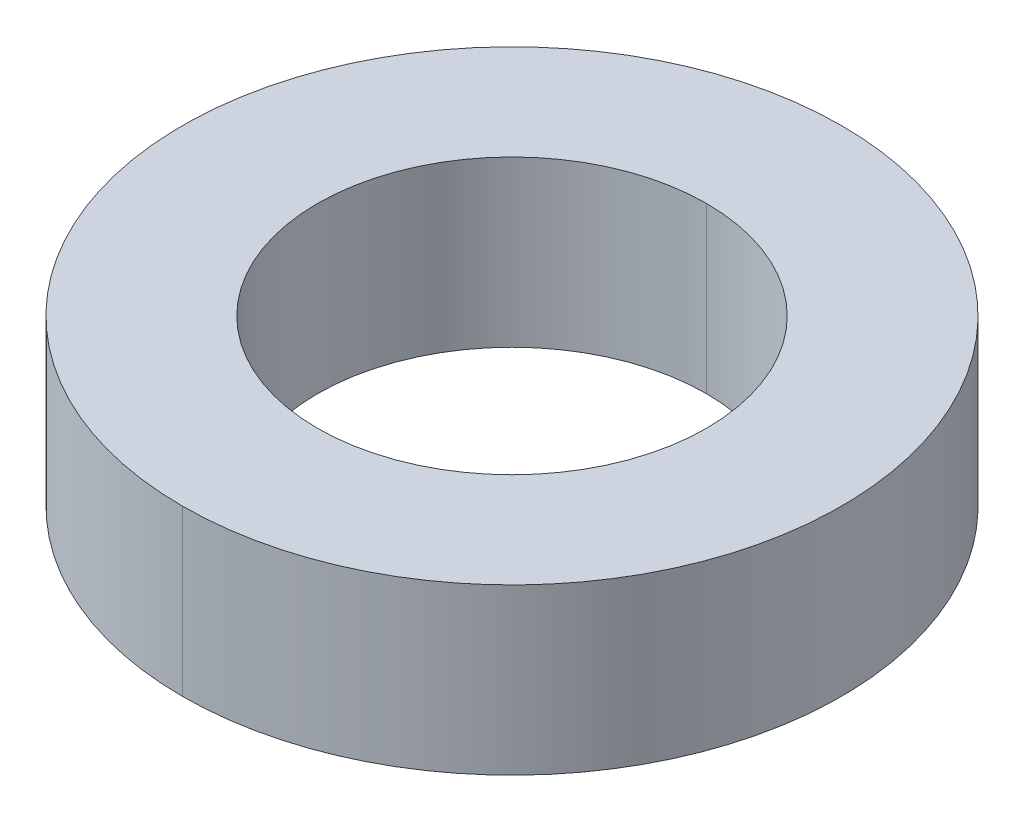
ISO-10303-21;
HEADER;
FILE_DESCRIPTION(('STEP AP214'),'2;1');
FILE_NAME('part.step','',(''),(''),'','','');
FILE_SCHEMA(('AUTOMOTIVE_DESIGN { 1 0 10303 214 1 1 1 1 }'));
ENDSEC;
DATA;
#1=APPLICATION_CONTEXT('core data for automotive mechanical design processes');
#2=APPLICATION_PROTOCOL_DEFINITION('international standard','automotive_design',2000,#1);
#3=PRODUCT_CONTEXT('',#1,'mechanical');
#4=PRODUCT('Part','Part','',(#3));
#5=PRODUCT_RELATED_PRODUCT_CATEGORY('part','',(#4));
#6=PRODUCT_DEFINITION_FORMATION('','',#4);
#7=PRODUCT_DEFINITION_CONTEXT('part definition',#1,'design');
#8=PRODUCT_DEFINITION('design','',#6,#7);
#9=PRODUCT_DEFINITION_SHAPE('','',#8);
#10=(LENGTH_UNIT() NAMED_UNIT(*) SI_UNIT(.MILLI.,.METRE.));
#11=(NAMED_UNIT(*) PLANE_ANGLE_UNIT() SI_UNIT($,.RADIAN.));
#12=(NAMED_UNIT(*) SI_UNIT($,.STERADIAN.) SOLID_ANGLE_UNIT());
#13=UNCERTAINTY_MEASURE_WITH_UNIT(LENGTH_MEASURE(1.E-05),#10,'distance_accuracy_value','');
#14=(GEOMETRIC_REPRESENTATION_CONTEXT(3) GLOBAL_UNCERTAINTY_ASSIGNED_CONTEXT((#13)) GLOBAL_UNIT_ASSIGNED_CONTEXT((#10,
#11,#12)) REPRESENTATION_CONTEXT('',''));
#15=CARTESIAN_POINT('',(0.,0.,0.));
#16=DIRECTION('',(0.,0.,1.));
#17=DIRECTION('',(1.,0.,0.));
#18=AXIS2_PLACEMENT_3D('',#15,#16,#17);
#19=CARTESIAN_POINT('',(0.,3.175,0.));
#20=DIRECTION('',(0.,-1.,0.));
#21=DIRECTION('',(0.,0.,-1.));
#22=AXIS2_PLACEMENT_3D('',#19,#20,#21);
#23=CYLINDRICAL_SURFACE('',#22,3.75);
#24=DIRECTION('',(0.,-1.,0.));
#25=VECTOR('',#24,1.);
#26=CARTESIAN_POINT('',(0.,3.175,3.75));
#27=LINE('',#26,#25);
#28=CARTESIAN_POINT('',(0.,3.175,3.75));
#29=VERTEX_POINT('',#28);
#30=CARTESIAN_POINT('',(0.,0.,3.75));
#31=VERTEX_POINT('',#30);
#32=EDGE_CURVE('E20',#29,#31,#27,.T.);
#33=ORIENTED_EDGE('',*,*,#32,.F.);
#34=CARTESIAN_POINT('',(0.,3.175,0.));
#35=DIRECTION('',(0.,1.,0.));
#36=DIRECTION('',(0.,0.,1.));
#37=AXIS2_PLACEMENT_3D('',#34,#35,#36);
#38=CIRCLE('',#37,3.75);
#39=CARTESIAN_POINT('',(0.,3.175,-3.75));
#40=VERTEX_POINT('',#39);
#41=EDGE_CURVE('E75',#29,#40,#38,.T.);
#42=ORIENTED_EDGE('',*,*,#41,.T.);
#43=DIRECTION('',(0.,-1.,0.));
#44=VECTOR('',#43,1.);
#45=CARTESIAN_POINT('',(0.,3.175,-3.75));
#46=LINE('',#45,#44);
#47=CARTESIAN_POINT('',(0.,0.,-3.75));
#48=VERTEX_POINT('',#47);
#49=EDGE_CURVE('E83',#40,#48,#46,.T.);
#50=ORIENTED_EDGE('',*,*,#49,.T.);
#51=CARTESIAN_POINT('',(0.,0.,0.));
#52=DIRECTION('',(0.,1.,0.));
#53=DIRECTION('',(0.,0.,1.));
#54=AXIS2_PLACEMENT_3D('',#51,#52,#53);
#55=CIRCLE('',#54,3.75);
#56=EDGE_CURVE('E11',#31,#48,#55,.T.);
#57=ORIENTED_EDGE('',*,*,#56,.F.);
#58=EDGE_LOOP('',(#33,#42,#50,#57));
#59=FACE_BOUND('',#58,.T.);
#60=ADVANCED_FACE('F16',(#59),#23,.F.);
#61=CARTESIAN_POINT('',(0.,3.175,0.));
#62=DIRECTION('',(0.,-1.,0.));
#63=DIRECTION('',(0.,0.,-1.));
#64=AXIS2_PLACEMENT_3D('',#61,#62,#63);
#65=CYLINDRICAL_SURFACE('',#64,6.35);
#66=DIRECTION('',(0.,-1.,0.));
#67=VECTOR('',#66,1.);
#68=CARTESIAN_POINT('',(0.,3.175,6.35));
#69=LINE('',#68,#67);
#70=CARTESIAN_POINT('',(0.,3.175,6.35));
#71=VERTEX_POINT('',#70);
#72=CARTESIAN_POINT('',(0.,0.,6.35));
#73=VERTEX_POINT('',#72);
#74=EDGE_CURVE('E70',#71,#73,#69,.T.);
#75=ORIENTED_EDGE('',*,*,#74,.F.);
#76=CARTESIAN_POINT('',(0.,3.175,0.));
#77=DIRECTION('',(0.,1.,0.));
#78=DIRECTION('',(0.,0.,1.));
#79=AXIS2_PLACEMENT_3D('',#76,#77,#78);
#80=CIRCLE('',#79,6.35);
#81=CARTESIAN_POINT('',(0.,3.175,-6.35));
#82=VERTEX_POINT('',#81);
#83=EDGE_CURVE('E64',#82,#71,#80,.T.);
#84=ORIENTED_EDGE('',*,*,#83,.F.);
#85=DIRECTION('',(0.,-1.,0.));
#86=VECTOR('',#85,1.);
#87=CARTESIAN_POINT('',(0.,3.175,-6.35));
#88=LINE('',#87,#86);
#89=CARTESIAN_POINT('',(0.,0.,-6.35));
#90=VERTEX_POINT('',#89);
#91=EDGE_CURVE('E67',#82,#90,#88,.T.);
#92=ORIENTED_EDGE('',*,*,#91,.T.);
#93=CARTESIAN_POINT('',(0.,0.,0.));
#94=DIRECTION('',(0.,1.,0.));
#95=DIRECTION('',(0.,0.,1.));
#96=AXIS2_PLACEMENT_3D('',#93,#94,#95);
#97=CIRCLE('',#96,6.35);
#98=EDGE_CURVE('E27',#90,#73,#97,.T.);
#99=ORIENTED_EDGE('',*,*,#98,.T.);
#100=EDGE_LOOP('',(#75,#84,#92,#99));
#101=FACE_BOUND('',#100,.T.);
#102=ADVANCED_FACE('F66',(#101),#65,.T.);
#103=CARTESIAN_POINT('',(0.,0.,0.));
#104=DIRECTION('',(0.,1.,0.));
#105=DIRECTION('',(1.,0.,0.));
#106=AXIS2_PLACEMENT_3D('',#103,#104,#105);
#107=PLANE('',#106);
#108=CARTESIAN_POINT('',(0.,0.,0.));
#109=DIRECTION('',(0.,1.,0.));
#110=DIRECTION('',(0.,0.,1.));
#111=AXIS2_PLACEMENT_3D('',#108,#109,#110);
#112=CIRCLE('',#111,3.75);
#113=EDGE_CURVE('E91',#48,#31,#112,.T.);
#114=ORIENTED_EDGE('',*,*,#113,.T.);
#115=ORIENTED_EDGE('',*,*,#56,.T.);
#116=EDGE_LOOP('',(#114,#115));
#117=FACE_BOUND('',#116,.T.);
#118=ORIENTED_EDGE('',*,*,#98,.F.);
#119=CARTESIAN_POINT('',(0.,0.,0.));
#120=DIRECTION('',(0.,1.,0.));
#121=DIRECTION('',(0.,0.,1.));
#122=AXIS2_PLACEMENT_3D('',#119,#120,#121);
#123=CIRCLE('',#122,6.35);
#124=EDGE_CURVE('E80',#73,#90,#123,.T.);
#125=ORIENTED_EDGE('',*,*,#124,.F.);
#126=EDGE_LOOP('',(#118,#125));
#127=FACE_BOUND('',#126,.T.);
#128=ADVANCED_FACE('F145',(#117,#127),#107,.F.);
#129=CARTESIAN_POINT('',(0.,3.175,0.));
#130=DIRECTION('',(0.,1.,0.));
#131=DIRECTION('',(1.,0.,0.));
#132=AXIS2_PLACEMENT_3D('',#129,#130,#131);
#133=PLANE('',#132);
#134=CARTESIAN_POINT('',(0.,3.175,0.));
#135=DIRECTION('',(0.,1.,0.));
#136=DIRECTION('',(0.,0.,1.));
#137=AXIS2_PLACEMENT_3D('',#134,#135,#136);
#138=CIRCLE('',#137,3.75);
#139=EDGE_CURVE('E94',#40,#29,#138,.T.);
#140=ORIENTED_EDGE('',*,*,#139,.F.);
#141=ORIENTED_EDGE('',*,*,#41,.F.);
#142=EDGE_LOOP('',(#140,#141));
#143=FACE_BOUND('',#142,.T.);
#144=ORIENTED_EDGE('',*,*,#83,.T.);
#145=CARTESIAN_POINT('',(0.,3.175,0.));
#146=DIRECTION('',(0.,1.,0.));
#147=DIRECTION('',(0.,0.,1.));
#148=AXIS2_PLACEMENT_3D('',#145,#146,#147);
#149=CIRCLE('',#148,6.35);
#150=EDGE_CURVE('E79',#71,#82,#149,.T.);
#151=ORIENTED_EDGE('',*,*,#150,.T.);
#152=EDGE_LOOP('',(#144,#151));
#153=FACE_BOUND('',#152,.T.);
#154=ADVANCED_FACE('F18',(#143,#153),#133,.T.);
#155=CARTESIAN_POINT('',(0.,3.175,0.));
#156=DIRECTION('',(0.,-1.,0.));
#157=DIRECTION('',(0.,0.,-1.));
#158=AXIS2_PLACEMENT_3D('',#155,#156,#157);
#159=CYLINDRICAL_SURFACE('',#158,6.35);
#160=ORIENTED_EDGE('',*,*,#150,.F.);
#161=ORIENTED_EDGE('',*,*,#74,.T.);
#162=ORIENTED_EDGE('',*,*,#124,.T.);
#163=ORIENTED_EDGE('',*,*,#91,.F.);
#164=EDGE_LOOP('',(#160,#161,#162,#163));
#165=FACE_BOUND('',#164,.T.);
#166=ADVANCED_FACE('F78',(#165),#159,.T.);
#167=CARTESIAN_POINT('',(0.,3.175,0.));
#168=DIRECTION('',(0.,-1.,0.));
#169=DIRECTION('',(0.,0.,-1.));
#170=AXIS2_PLACEMENT_3D('',#167,#168,#169);
#171=CYLINDRICAL_SURFACE('',#170,3.75);
#172=ORIENTED_EDGE('',*,*,#139,.T.);
#173=ORIENTED_EDGE('',*,*,#32,.T.);
#174=ORIENTED_EDGE('',*,*,#113,.F.);
#175=ORIENTED_EDGE('',*,*,#49,.F.);
#176=EDGE_LOOP('',(#172,#173,#174,#175));
#177=FACE_BOUND('',#176,.T.);
#178=ADVANCED_FACE('F162',(#177),#171,.F.);
#179=CLOSED_SHELL('',(#60,#102,#128,#154,#166,#178));
#180=MANIFOLD_SOLID_BREP('B1',#179);
#181=ADVANCED_BREP_SHAPE_REPRESENTATION('',(#18,#180),#14);
#182=SHAPE_DEFINITION_REPRESENTATION(#9,#181);
ENDSEC;
END-ISO-10303-21;
